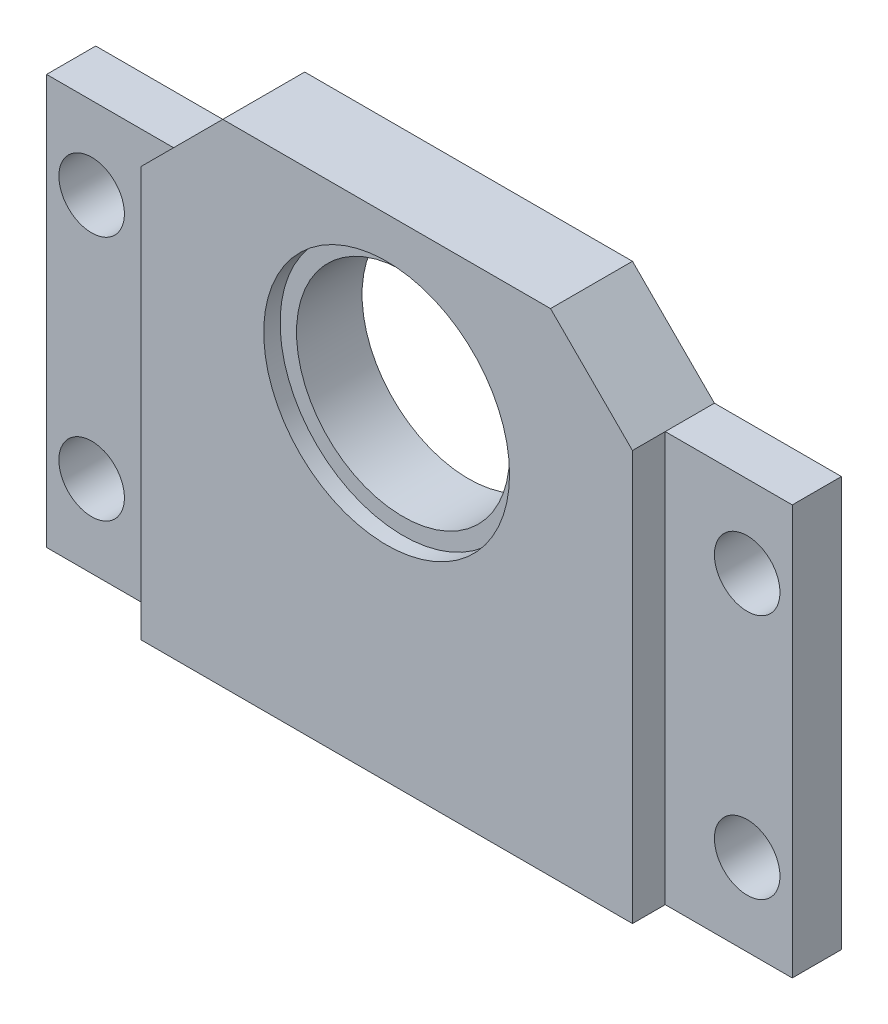
ISO-10303-21;
HEADER;
FILE_DESCRIPTION(('STEP AP214'),'2;1');
FILE_NAME('part.step','',(''),(''),'','','');
FILE_SCHEMA(('AUTOMOTIVE_DESIGN { 1 0 10303 214 1 1 1 1 }'));
ENDSEC;
DATA;
#1=APPLICATION_CONTEXT('core data for automotive mechanical design processes');
#2=APPLICATION_PROTOCOL_DEFINITION('international standard','automotive_design',2000,#1);
#3=PRODUCT_CONTEXT('',#1,'mechanical');
#4=PRODUCT('Part','Part','',(#3));
#5=PRODUCT_RELATED_PRODUCT_CATEGORY('part','',(#4));
#6=PRODUCT_DEFINITION_FORMATION('','',#4);
#7=PRODUCT_DEFINITION_CONTEXT('part definition',#1,'design');
#8=PRODUCT_DEFINITION('design','',#6,#7);
#9=PRODUCT_DEFINITION_SHAPE('','',#8);
#10=(LENGTH_UNIT() NAMED_UNIT(*) SI_UNIT(.MILLI.,.METRE.));
#11=(NAMED_UNIT(*) PLANE_ANGLE_UNIT() SI_UNIT($,.RADIAN.));
#12=(NAMED_UNIT(*) SI_UNIT($,.STERADIAN.) SOLID_ANGLE_UNIT());
#13=UNCERTAINTY_MEASURE_WITH_UNIT(LENGTH_MEASURE(1.E-05),#10,'distance_accuracy_value','');
#14=(GEOMETRIC_REPRESENTATION_CONTEXT(3) GLOBAL_UNCERTAINTY_ASSIGNED_CONTEXT((#13)) GLOBAL_UNIT_ASSIGNED_CONTEXT((#10,
#11,#12)) REPRESENTATION_CONTEXT('',''));
#15=CARTESIAN_POINT('',(0.,0.,0.));
#16=DIRECTION('',(0.,0.,1.));
#17=DIRECTION('',(1.,0.,0.));
#18=AXIS2_PLACEMENT_3D('',#15,#16,#17);
#19=CARTESIAN_POINT('',(22.75,20.,-5.00000000001367E-05));
#20=DIRECTION('',(0.,0.,1.));
#21=DIRECTION('',(1.,0.,0.));
#22=AXIS2_PLACEMENT_3D('',#19,#20,#21);
#23=CYLINDRICAL_SURFACE('',#22,6.5);
#24=CARTESIAN_POINT('',(22.75,20.,0.));
#25=DIRECTION('',(0.,0.,-1.));
#26=DIRECTION('',(-1.,0.,0.));
#27=AXIS2_PLACEMENT_3D('',#24,#25,#26);
#28=CIRCLE('',#27,6.5);
#29=CARTESIAN_POINT('',(29.25,20.,0.));
#30=VERTEX_POINT('',#29);
#31=EDGE_CURVE('E141',#30,#30,#28,.T.);
#32=CARTESIAN_POINT('',(22.75,20.,4.));
#33=DIRECTION('',(0.,0.,1.));
#34=DIRECTION('',(1.,0.,0.));
#35=AXIS2_PLACEMENT_3D('',#32,#33,#34);
#36=CIRCLE('',#35,6.5);
#37=CARTESIAN_POINT('',(29.25,20.,4.));
#38=VERTEX_POINT('',#37);
#39=EDGE_CURVE('E37',#38,#38,#36,.F.);
#40=CARTESIAN_POINT('',(29.25,20.,0.));
#41=CARTESIAN_POINT('',(29.25,20.,0.0416666666666666));
#42=CARTESIAN_POINT('',(29.25,20.,0.0833333333333333));
#43=CARTESIAN_POINT('',(29.25,20.,0.166666666666667));
#44=CARTESIAN_POINT('',(29.25,20.,0.208333333333333));
#45=CARTESIAN_POINT('',(29.25,20.,0.291666666666667));
#46=CARTESIAN_POINT('',(29.25,20.,0.333333333333333));
#47=CARTESIAN_POINT('',(29.25,20.,0.416666666666666));
#48=CARTESIAN_POINT('',(29.25,20.,0.458333333333333));
#49=CARTESIAN_POINT('',(29.25,20.,0.541666666666666));
#50=CARTESIAN_POINT('',(29.25,20.,0.583333333333333));
#51=CARTESIAN_POINT('',(29.25,20.,0.666666666666666));
#52=CARTESIAN_POINT('',(29.25,20.,0.708333333333333));
#53=CARTESIAN_POINT('',(29.25,20.,0.791666666666666));
#54=CARTESIAN_POINT('',(29.25,20.,0.833333333333333));
#55=CARTESIAN_POINT('',(29.25,20.,0.916666666666666));
#56=CARTESIAN_POINT('',(29.25,20.,0.958333333333333));
#57=CARTESIAN_POINT('',(29.25,20.,1.04166666666667));
#58=CARTESIAN_POINT('',(29.25,20.,1.08333333333333));
#59=CARTESIAN_POINT('',(29.25,20.,1.16666666666667));
#60=CARTESIAN_POINT('',(29.25,20.,1.20833333333333));
#61=CARTESIAN_POINT('',(29.25,20.,1.29166666666667));
#62=CARTESIAN_POINT('',(29.25,20.,1.33333333333333));
#63=CARTESIAN_POINT('',(29.25,20.,1.41666666666667));
#64=CARTESIAN_POINT('',(29.25,20.,1.45833333333333));
#65=CARTESIAN_POINT('',(29.25,20.,1.54166666666667));
#66=CARTESIAN_POINT('',(29.25,20.,1.58333333333333));
#67=CARTESIAN_POINT('',(29.25,20.,1.66666666666667));
#68=CARTESIAN_POINT('',(29.25,20.,1.70833333333333));
#69=CARTESIAN_POINT('',(29.25,20.,1.79166666666667));
#70=CARTESIAN_POINT('',(29.25,20.,1.83333333333333));
#71=CARTESIAN_POINT('',(29.25,20.,1.91666666666667));
#72=CARTESIAN_POINT('',(29.25,20.,1.95833333333333));
#73=CARTESIAN_POINT('',(29.25,20.,2.04166666666667));
#74=CARTESIAN_POINT('',(29.25,20.,2.08333333333333));
#75=CARTESIAN_POINT('',(29.25,20.,2.16666666666667));
#76=CARTESIAN_POINT('',(29.25,20.,2.20833333333333));
#77=CARTESIAN_POINT('',(29.25,20.,2.29166666666667));
#78=CARTESIAN_POINT('',(29.25,20.,2.33333333333333));
#79=CARTESIAN_POINT('',(29.25,20.,2.41666666666667));
#80=CARTESIAN_POINT('',(29.25,20.,2.45833333333333));
#81=CARTESIAN_POINT('',(29.25,20.,2.54166666666667));
#82=CARTESIAN_POINT('',(29.25,20.,2.58333333333333));
#83=CARTESIAN_POINT('',(29.25,20.,2.66666666666667));
#84=CARTESIAN_POINT('',(29.25,20.,2.70833333333333));
#85=CARTESIAN_POINT('',(29.25,20.,2.79166666666667));
#86=CARTESIAN_POINT('',(29.25,20.,2.83333333333333));
#87=CARTESIAN_POINT('',(29.25,20.,2.91666666666667));
#88=CARTESIAN_POINT('',(29.25,20.,2.95833333333333));
#89=CARTESIAN_POINT('',(29.25,20.,3.04166666666667));
#90=CARTESIAN_POINT('',(29.25,20.,3.08333333333333));
#91=CARTESIAN_POINT('',(29.25,20.,3.16666666666667));
#92=CARTESIAN_POINT('',(29.25,20.,3.20833333333333));
#93=CARTESIAN_POINT('',(29.25,20.,3.29166666666667));
#94=CARTESIAN_POINT('',(29.25,20.,3.33333333333333));
#95=CARTESIAN_POINT('',(29.25,20.,3.41666666666667));
#96=CARTESIAN_POINT('',(29.25,20.,3.45833333333333));
#97=CARTESIAN_POINT('',(29.25,20.,3.54166666666667));
#98=CARTESIAN_POINT('',(29.25,20.,3.58333333333333));
#99=CARTESIAN_POINT('',(29.25,20.,3.66666666666667));
#100=CARTESIAN_POINT('',(29.25,20.,3.70833333333333));
#101=CARTESIAN_POINT('',(29.25,20.,3.79166666666667));
#102=CARTESIAN_POINT('',(29.25,20.,3.83333333333333));
#103=CARTESIAN_POINT('',(29.25,20.,3.91666666666667));
#104=CARTESIAN_POINT('',(29.25,20.,3.95833333333333));
#105=CARTESIAN_POINT('',(29.25,20.,4.));
#106=B_SPLINE_CURVE_WITH_KNOTS('',3,(#40,#41,#42,#43,#44,#45,#46,#47,#48,#49,#50,#51,#52,#53,
#54,#55,#56,#57,#58,#59,#60,#61,#62,#63,#64,#65,#66,#67,#68,#69,#70,#71,#72,#73,#74,#75,#76,#77,
#78,#79,#80,#81,#82,#83,#84,#85,#86,#87,#88,#89,#90,#91,#92,#93,#94,#95,#96,#97,#98,#99,#100,
#101,#102,#103,#104,#105),.UNSPECIFIED.,.F.,.F.,(4,2,2,2,2,2,2,2,2,2,2,2,2,2,2,2,2,2,2,2,2,2,2,
2,2,2,2,2,2,2,2,2,4),(0.,0.125,0.25,0.375,0.5,0.625,0.75,0.875,1.,1.125,1.25,1.375,1.5,1.625,
1.75,1.875,2.,2.125,2.25,2.375,2.5,2.625,2.75,2.875,3.,3.125,3.25,3.375,3.5,3.625,3.75,3.875,
4.),.UNSPECIFIED.);
#107=EDGE_CURVE('BSEAM33',#30,#38,#106,.T.);
#108=ORIENTED_EDGE('',*,*,#31,.T.);
#109=ORIENTED_EDGE('',*,*,#39,.F.);
#110=ORIENTED_EDGE('',*,*,#107,.T.);
#111=ORIENTED_EDGE('',*,*,#107,.F.);
#112=EDGE_LOOP('',(#108,#110,#109,#111));
#113=FACE_BOUND('',#112,.T.);
#114=ADVANCED_FACE('F33',(#113),#23,.F.);
#115=CARTESIAN_POINT('',(0.,0.,3.));
#116=DIRECTION('',(0.,0.,-1.));
#117=DIRECTION('',(-1.,0.,0.));
#118=AXIS2_PLACEMENT_3D('',#115,#116,#117);
#119=PLANE('',#118);
#120=CARTESIAN_POINT('',(42.75,20.,3.));
#121=DIRECTION('',(0.,0.,1.));
#122=DIRECTION('',(-1.,0.,0.));
#123=AXIS2_PLACEMENT_3D('',#120,#121,#122);
#124=CIRCLE('',#123,2.);
#125=CARTESIAN_POINT('',(40.75,20.,3.));
#126=VERTEX_POINT('',#125);
#127=EDGE_CURVE('E166',#126,#126,#124,.T.);
#128=ORIENTED_EDGE('',*,*,#127,.F.);
#129=EDGE_LOOP('',(#128));
#130=FACE_BOUND('',#129,.T.);
#131=CARTESIAN_POINT('',(42.75,5.,3.));
#132=DIRECTION('',(0.,0.,1.));
#133=DIRECTION('',(1.,0.,0.));
#134=AXIS2_PLACEMENT_3D('',#131,#132,#133);
#135=CIRCLE('',#134,2.);
#136=CARTESIAN_POINT('',(44.75,5.,3.));
#137=VERTEX_POINT('',#136);
#138=EDGE_CURVE('E160',#137,#137,#135,.T.);
#139=ORIENTED_EDGE('',*,*,#138,.F.);
#140=EDGE_LOOP('',(#139));
#141=FACE_BOUND('',#140,.T.);
#142=DIRECTION('',(0.,1.,0.));
#143=VECTOR('',#142,1.);
#144=CARTESIAN_POINT('',(37.75,25.,3.));
#145=LINE('',#144,#143);
#146=CARTESIAN_POINT('',(37.75,0.,3.));
#147=VERTEX_POINT('',#146);
#148=CARTESIAN_POINT('',(37.75,25.,3.));
#149=VERTEX_POINT('',#148);
#150=EDGE_CURVE('E49',#147,#149,#145,.T.);
#151=ORIENTED_EDGE('',*,*,#150,.F.);
#152=DIRECTION('',(1.,0.,0.));
#153=VECTOR('',#152,1.);
#154=CARTESIAN_POINT('',(0.,0.,3.));
#155=LINE('',#154,#153);
#156=CARTESIAN_POINT('',(45.5,0.,3.));
#157=VERTEX_POINT('',#156);
#158=EDGE_CURVE('E184',#147,#157,#155,.T.);
#159=ORIENTED_EDGE('',*,*,#158,.T.);
#160=DIRECTION('',(0.,1.,0.));
#161=VECTOR('',#160,1.);
#162=CARTESIAN_POINT('',(45.5,0.,3.));
#163=LINE('',#162,#161);
#164=CARTESIAN_POINT('',(45.5,25.,3.));
#165=VERTEX_POINT('',#164);
#166=EDGE_CURVE('E188',#157,#165,#163,.T.);
#167=ORIENTED_EDGE('',*,*,#166,.T.);
#168=DIRECTION('',(-1.,0.,0.));
#169=VECTOR('',#168,1.);
#170=CARTESIAN_POINT('',(0.,25.,3.));
#171=LINE('',#170,#169);
#172=EDGE_CURVE('E199',#165,#149,#171,.T.);
#173=ORIENTED_EDGE('',*,*,#172,.T.);
#174=EDGE_LOOP('',(#151,#159,#167,#173));
#175=FACE_BOUND('',#174,.T.);
#176=ADVANCED_FACE('F273',(#130,#141,#175),#119,.F.);
#177=CARTESIAN_POINT('',(2.75,20.,3.));
#178=DIRECTION('',(0.,0.,1.));
#179=DIRECTION('',(1.,0.,0.));
#180=AXIS2_PLACEMENT_3D('',#177,#178,#179);
#181=CIRCLE('',#180,2.);
#182=CARTESIAN_POINT('',(4.75,20.,3.));
#183=VERTEX_POINT('',#182);
#184=EDGE_CURVE('E172',#183,#183,#181,.T.);
#185=ORIENTED_EDGE('',*,*,#184,.F.);
#186=EDGE_LOOP('',(#185));
#187=FACE_BOUND('',#186,.T.);
#188=CARTESIAN_POINT('',(2.75,5.,3.));
#189=DIRECTION('',(0.,0.,1.));
#190=DIRECTION('',(-1.,0.,0.));
#191=AXIS2_PLACEMENT_3D('',#188,#189,#190);
#192=CIRCLE('',#191,2.);
#193=CARTESIAN_POINT('',(0.749999999999998,5.,3.));
#194=VERTEX_POINT('',#193);
#195=EDGE_CURVE('E155',#194,#194,#192,.T.);
#196=ORIENTED_EDGE('',*,*,#195,.F.);
#197=EDGE_LOOP('',(#196));
#198=FACE_BOUND('',#197,.T.);
#199=DIRECTION('',(0.,-1.,0.));
#200=VECTOR('',#199,1.);
#201=CARTESIAN_POINT('',(7.75,25.,3.));
#202=LINE('',#201,#200);
#203=CARTESIAN_POINT('',(7.75000000000002,25.,3.));
#204=VERTEX_POINT('',#203);
#205=CARTESIAN_POINT('',(7.75,0.,3.));
#206=VERTEX_POINT('',#205);
#207=EDGE_CURVE('E57',#204,#206,#202,.T.);
#208=ORIENTED_EDGE('',*,*,#207,.F.);
#209=CARTESIAN_POINT('',(0.,25.,3.));
#210=VERTEX_POINT('',#209);
#211=EDGE_CURVE('E190',#204,#210,#171,.T.);
#212=ORIENTED_EDGE('',*,*,#211,.T.);
#213=DIRECTION('',(0.,-1.,0.));
#214=VECTOR('',#213,1.);
#215=CARTESIAN_POINT('',(0.,0.,3.));
#216=LINE('',#215,#214);
#217=CARTESIAN_POINT('',(0.,0.,3.));
#218=VERTEX_POINT('',#217);
#219=EDGE_CURVE('E181',#210,#218,#216,.T.);
#220=ORIENTED_EDGE('',*,*,#219,.T.);
#221=EDGE_CURVE('E186',#218,#206,#155,.T.);
#222=ORIENTED_EDGE('',*,*,#221,.T.);
#223=EDGE_LOOP('',(#208,#212,#220,#222));
#224=FACE_BOUND('',#223,.T.);
#225=ADVANCED_FACE('F275',(#187,#198,#224),#119,.F.);
#226=CARTESIAN_POINT('',(0.,25.,3.));
#227=DIRECTION('',(0.,-1.,0.));
#228=DIRECTION('',(0.,0.,-1.));
#229=AXIS2_PLACEMENT_3D('',#226,#227,#228);
#230=PLANE('',#229);
#231=ORIENTED_EDGE('',*,*,#211,.F.);
#232=DIRECTION('',(0.,0.,-1.));
#233=VECTOR('',#232,1.);
#234=CARTESIAN_POINT('',(7.75000000000002,25.,3.));
#235=LINE('',#234,#233);
#236=CARTESIAN_POINT('',(7.75000000000002,25.,0.));
#237=VERTEX_POINT('',#236);
#238=EDGE_CURVE('E140',#204,#237,#235,.T.);
#239=ORIENTED_EDGE('',*,*,#238,.T.);
#240=DIRECTION('',(-1.,0.,0.));
#241=VECTOR('',#240,1.);
#242=CARTESIAN_POINT('',(0.,25.,0.));
#243=LINE('',#242,#241);
#244=CARTESIAN_POINT('',(0.,25.,0.));
#245=VERTEX_POINT('',#244);
#246=EDGE_CURVE('E207',#237,#245,#243,.T.);
#247=ORIENTED_EDGE('',*,*,#246,.T.);
#248=DIRECTION('',(0.,0.,-1.));
#249=VECTOR('',#248,1.);
#250=CARTESIAN_POINT('',(0.,25.,3.));
#251=LINE('',#250,#249);
#252=EDGE_CURVE('E201',#210,#245,#251,.T.);
#253=ORIENTED_EDGE('',*,*,#252,.F.);
#254=EDGE_LOOP('',(#231,#239,#247,#253));
#255=FACE_BOUND('',#254,.T.);
#256=ADVANCED_FACE('F251',(#255),#230,.F.);
#257=CARTESIAN_POINT('',(0.,0.,3.));
#258=DIRECTION('',(1.,0.,0.));
#259=DIRECTION('',(0.,0.,-1.));
#260=AXIS2_PLACEMENT_3D('',#257,#258,#259);
#261=PLANE('',#260);
#262=DIRECTION('',(0.,-1.,0.));
#263=VECTOR('',#262,1.);
#264=CARTESIAN_POINT('',(0.,0.,0.));
#265=LINE('',#264,#263);
#266=CARTESIAN_POINT('',(0.,0.,0.));
#267=VERTEX_POINT('',#266);
#268=EDGE_CURVE('E178',#245,#267,#265,.T.);
#269=ORIENTED_EDGE('',*,*,#268,.T.);
#270=DIRECTION('',(0.,0.,-1.));
#271=VECTOR('',#270,1.);
#272=CARTESIAN_POINT('',(0.,0.,3.));
#273=LINE('',#272,#271);
#274=EDGE_CURVE('E206',#218,#267,#273,.T.);
#275=ORIENTED_EDGE('',*,*,#274,.F.);
#276=ORIENTED_EDGE('',*,*,#219,.F.);
#277=ORIENTED_EDGE('',*,*,#252,.T.);
#278=EDGE_LOOP('',(#269,#275,#276,#277));
#279=FACE_BOUND('',#278,.T.);
#280=ADVANCED_FACE('F230',(#279),#261,.F.);
#281=CARTESIAN_POINT('',(0.,0.,3.));
#282=DIRECTION('',(0.,1.,0.));
#283=DIRECTION('',(0.,0.,1.));
#284=AXIS2_PLACEMENT_3D('',#281,#282,#283);
#285=PLANE('',#284);
#286=DIRECTION('',(1.,0.,0.));
#287=VECTOR('',#286,1.);
#288=CARTESIAN_POINT('',(0.,0.,0.));
#289=LINE('',#288,#287);
#290=CARTESIAN_POINT('',(45.5,0.,0.));
#291=VERTEX_POINT('',#290);
#292=EDGE_CURVE('E226',#267,#291,#289,.T.);
#293=ORIENTED_EDGE('',*,*,#292,.T.);
#294=DIRECTION('',(0.,0.,-1.));
#295=VECTOR('',#294,1.);
#296=CARTESIAN_POINT('',(45.5,0.,3.));
#297=LINE('',#296,#295);
#298=EDGE_CURVE('E218',#157,#291,#297,.T.);
#299=ORIENTED_EDGE('',*,*,#298,.F.);
#300=ORIENTED_EDGE('',*,*,#158,.F.);
#301=DIRECTION('',(0.,0.,-1.));
#302=VECTOR('',#301,1.);
#303=CARTESIAN_POINT('',(37.75,0.,5.));
#304=LINE('',#303,#302);
#305=CARTESIAN_POINT('',(37.75,0.,5.));
#306=VERTEX_POINT('',#305);
#307=EDGE_CURVE('E146',#306,#147,#304,.T.);
#308=ORIENTED_EDGE('',*,*,#307,.F.);
#309=DIRECTION('',(1.,0.,0.));
#310=VECTOR('',#309,1.);
#311=CARTESIAN_POINT('',(7.75,0.,5.));
#312=LINE('',#311,#310);
#313=CARTESIAN_POINT('',(7.75,0.,5.));
#314=VERTEX_POINT('',#313);
#315=EDGE_CURVE('E126',#314,#306,#312,.T.);
#316=ORIENTED_EDGE('',*,*,#315,.F.);
#317=DIRECTION('',(0.,0.,-1.));
#318=VECTOR('',#317,1.);
#319=CARTESIAN_POINT('',(7.75,0.,5.));
#320=LINE('',#319,#318);
#321=EDGE_CURVE('E123',#314,#206,#320,.T.);
#322=ORIENTED_EDGE('',*,*,#321,.T.);
#323=ORIENTED_EDGE('',*,*,#221,.F.);
#324=ORIENTED_EDGE('',*,*,#274,.T.);
#325=EDGE_LOOP('',(#293,#299,#300,#308,#316,#322,#323,#324));
#326=FACE_BOUND('',#325,.T.);
#327=ADVANCED_FACE('F224',(#326),#285,.F.);
#328=CARTESIAN_POINT('',(45.5,0.,3.));
#329=DIRECTION('',(-1.,0.,0.));
#330=DIRECTION('',(0.,0.,1.));
#331=AXIS2_PLACEMENT_3D('',#328,#329,#330);
#332=PLANE('',#331);
#333=DIRECTION('',(0.,1.,0.));
#334=VECTOR('',#333,1.);
#335=CARTESIAN_POINT('',(45.5,0.,0.));
#336=LINE('',#335,#334);
#337=CARTESIAN_POINT('',(45.5,25.,0.));
#338=VERTEX_POINT('',#337);
#339=EDGE_CURVE('E208',#291,#338,#336,.T.);
#340=ORIENTED_EDGE('',*,*,#339,.T.);
#341=DIRECTION('',(0.,0.,-1.));
#342=VECTOR('',#341,1.);
#343=CARTESIAN_POINT('',(45.5,25.,3.));
#344=LINE('',#343,#342);
#345=EDGE_CURVE('E215',#165,#338,#344,.T.);
#346=ORIENTED_EDGE('',*,*,#345,.F.);
#347=ORIENTED_EDGE('',*,*,#166,.F.);
#348=ORIENTED_EDGE('',*,*,#298,.T.);
#349=EDGE_LOOP('',(#340,#346,#347,#348));
#350=FACE_BOUND('',#349,.T.);
#351=ADVANCED_FACE('F237',(#350),#332,.F.);
#352=CARTESIAN_POINT('',(37.75,25.,0.));
#353=VERTEX_POINT('',#352);
#354=EDGE_CURVE('E185',#338,#353,#243,.T.);
#355=ORIENTED_EDGE('',*,*,#354,.T.);
#356=DIRECTION('',(0.,0.,1.));
#357=VECTOR('',#356,1.);
#358=CARTESIAN_POINT('',(37.75,25.,3.));
#359=LINE('',#358,#357);
#360=EDGE_CURVE('E205',#353,#149,#359,.T.);
#361=ORIENTED_EDGE('',*,*,#360,.T.);
#362=ORIENTED_EDGE('',*,*,#172,.F.);
#363=ORIENTED_EDGE('',*,*,#345,.T.);
#364=EDGE_LOOP('',(#355,#361,#362,#363));
#365=FACE_BOUND('',#364,.T.);
#366=ADVANCED_FACE('F243',(#365),#230,.F.);
#367=CARTESIAN_POINT('',(0.,0.,0.));
#368=DIRECTION('',(0.,0.,-1.));
#369=DIRECTION('',(-1.,0.,0.));
#370=AXIS2_PLACEMENT_3D('',#367,#368,#369);
#371=PLANE('',#370);
#372=ORIENTED_EDGE('',*,*,#31,.F.);
#373=EDGE_LOOP('',(#372));
#374=FACE_BOUND('',#373,.T.);
#375=CARTESIAN_POINT('',(2.75,5.,0.));
#376=DIRECTION('',(0.,0.,1.));
#377=DIRECTION('',(-1.,0.,0.));
#378=AXIS2_PLACEMENT_3D('',#375,#376,#377);
#379=CIRCLE('',#378,2.);
#380=CARTESIAN_POINT('',(0.749999999999998,5.,0.));
#381=VERTEX_POINT('',#380);
#382=EDGE_CURVE('E157',#381,#381,#379,.T.);
#383=ORIENTED_EDGE('',*,*,#382,.T.);
#384=EDGE_LOOP('',(#383));
#385=FACE_BOUND('',#384,.T.);
#386=CARTESIAN_POINT('',(42.75,5.,0.));
#387=DIRECTION('',(0.,0.,1.));
#388=DIRECTION('',(1.,0.,0.));
#389=AXIS2_PLACEMENT_3D('',#386,#387,#388);
#390=CIRCLE('',#389,2.);
#391=CARTESIAN_POINT('',(44.75,5.,0.));
#392=VERTEX_POINT('',#391);
#393=EDGE_CURVE('E163',#392,#392,#390,.T.);
#394=ORIENTED_EDGE('',*,*,#393,.T.);
#395=EDGE_LOOP('',(#394));
#396=FACE_BOUND('',#395,.T.);
#397=CARTESIAN_POINT('',(42.75,20.,0.));
#398=DIRECTION('',(0.,0.,1.));
#399=DIRECTION('',(-1.,0.,0.));
#400=AXIS2_PLACEMENT_3D('',#397,#398,#399);
#401=CIRCLE('',#400,2.);
#402=CARTESIAN_POINT('',(40.75,20.,0.));
#403=VERTEX_POINT('',#402);
#404=EDGE_CURVE('E169',#403,#403,#401,.T.);
#405=ORIENTED_EDGE('',*,*,#404,.T.);
#406=EDGE_LOOP('',(#405));
#407=FACE_BOUND('',#406,.T.);
#408=CARTESIAN_POINT('',(2.75,20.,0.));
#409=DIRECTION('',(0.,0.,1.));
#410=DIRECTION('',(1.,0.,0.));
#411=AXIS2_PLACEMENT_3D('',#408,#409,#410);
#412=CIRCLE('',#411,2.);
#413=CARTESIAN_POINT('',(4.75,20.,0.));
#414=VERTEX_POINT('',#413);
#415=EDGE_CURVE('E175',#414,#414,#412,.T.);
#416=ORIENTED_EDGE('',*,*,#415,.T.);
#417=EDGE_LOOP('',(#416));
#418=FACE_BOUND('',#417,.T.);
#419=ORIENTED_EDGE('',*,*,#268,.F.);
#420=ORIENTED_EDGE('',*,*,#246,.F.);
#421=DIRECTION('',(0.707106781186544,0.707106781186551,0.));
#422=VECTOR('',#421,1.);
#423=CARTESIAN_POINT('',(12.75,30.,0.));
#424=LINE('',#423,#422);
#425=CARTESIAN_POINT('',(12.75,30.,0.));
#426=VERTEX_POINT('',#425);
#427=EDGE_CURVE('E11',#237,#426,#424,.T.);
#428=ORIENTED_EDGE('',*,*,#427,.T.);
#429=DIRECTION('',(-1.,0.,0.));
#430=VECTOR('',#429,1.);
#431=CARTESIAN_POINT('',(12.75,30.,0.));
#432=LINE('',#431,#430);
#433=CARTESIAN_POINT('',(32.75,30.,0.));
#434=VERTEX_POINT('',#433);
#435=EDGE_CURVE('E144',#434,#426,#432,.T.);
#436=ORIENTED_EDGE('',*,*,#435,.F.);
#437=DIRECTION('',(0.707106781186552,-0.707106781186543,0.));
#438=VECTOR('',#437,1.);
#439=CARTESIAN_POINT('',(37.75,25.,0.));
#440=LINE('',#439,#438);
#441=EDGE_CURVE('E42',#434,#353,#440,.T.);
#442=ORIENTED_EDGE('',*,*,#441,.T.);
#443=ORIENTED_EDGE('',*,*,#354,.F.);
#444=ORIENTED_EDGE('',*,*,#339,.F.);
#445=ORIENTED_EDGE('',*,*,#292,.F.);
#446=EDGE_LOOP('',(#419,#420,#428,#436,#442,#443,#444,#445));
#447=FACE_BOUND('',#446,.T.);
#448=ADVANCED_FACE('F245',(#374,#385,#396,#407,#418,#447),#371,.T.);
#449=CARTESIAN_POINT('',(2.75,20.,0.));
#450=DIRECTION('',(0.,0.,1.));
#451=DIRECTION('',(1.,0.,0.));
#452=AXIS2_PLACEMENT_3D('',#449,#450,#451);
#453=CYLINDRICAL_SURFACE('',#452,2.);
#454=ORIENTED_EDGE('',*,*,#415,.F.);
#455=EDGE_LOOP('',(#454));
#456=FACE_BOUND('',#455,.T.);
#457=ORIENTED_EDGE('',*,*,#184,.T.);
#458=EDGE_LOOP('',(#457));
#459=FACE_BOUND('',#458,.T.);
#460=ADVANCED_FACE('F289',(#456,#459),#453,.F.);
#461=CARTESIAN_POINT('',(42.75,20.,0.));
#462=DIRECTION('',(0.,0.,1.));
#463=DIRECTION('',(1.,0.,0.));
#464=AXIS2_PLACEMENT_3D('',#461,#462,#463);
#465=CYLINDRICAL_SURFACE('',#464,2.);
#466=ORIENTED_EDGE('',*,*,#404,.F.);
#467=EDGE_LOOP('',(#466));
#468=FACE_BOUND('',#467,.T.);
#469=ORIENTED_EDGE('',*,*,#127,.T.);
#470=EDGE_LOOP('',(#469));
#471=FACE_BOUND('',#470,.T.);
#472=ADVANCED_FACE('F317',(#468,#471),#465,.F.);
#473=CARTESIAN_POINT('',(42.75,5.,0.));
#474=DIRECTION('',(0.,0.,1.));
#475=DIRECTION('',(1.,0.,0.));
#476=AXIS2_PLACEMENT_3D('',#473,#474,#475);
#477=CYLINDRICAL_SURFACE('',#476,2.);
#478=ORIENTED_EDGE('',*,*,#393,.F.);
#479=EDGE_LOOP('',(#478));
#480=FACE_BOUND('',#479,.T.);
#481=ORIENTED_EDGE('',*,*,#138,.T.);
#482=EDGE_LOOP('',(#481));
#483=FACE_BOUND('',#482,.T.);
#484=ADVANCED_FACE('F311',(#480,#483),#477,.F.);
#485=CARTESIAN_POINT('',(2.75,5.,0.));
#486=DIRECTION('',(0.,0.,1.));
#487=DIRECTION('',(1.,0.,0.));
#488=AXIS2_PLACEMENT_3D('',#485,#486,#487);
#489=CYLINDRICAL_SURFACE('',#488,2.);
#490=ORIENTED_EDGE('',*,*,#382,.F.);
#491=EDGE_LOOP('',(#490));
#492=FACE_BOUND('',#491,.T.);
#493=ORIENTED_EDGE('',*,*,#195,.T.);
#494=EDGE_LOOP('',(#493));
#495=FACE_BOUND('',#494,.T.);
#496=ADVANCED_FACE('F306',(#492,#495),#489,.F.);
#497=CARTESIAN_POINT('',(12.75,30.,0.));
#498=DIRECTION('',(0.,1.,0.));
#499=DIRECTION('',(-1.,0.,0.));
#500=AXIS2_PLACEMENT_3D('',#497,#498,#499);
#501=PLANE('',#500);
#502=DIRECTION('',(0.,0.,1.));
#503=VECTOR('',#502,1.);
#504=CARTESIAN_POINT('',(12.75,30.,0.));
#505=LINE('',#504,#503);
#506=CARTESIAN_POINT('',(12.75,30.,5.));
#507=VERTEX_POINT('',#506);
#508=EDGE_CURVE('E153',#426,#507,#505,.T.);
#509=ORIENTED_EDGE('',*,*,#508,.T.);
#510=DIRECTION('',(-1.,0.,0.));
#511=VECTOR('',#510,1.);
#512=CARTESIAN_POINT('',(32.75,30.,5.));
#513=LINE('',#512,#511);
#514=CARTESIAN_POINT('',(32.75,30.,5.));
#515=VERTEX_POINT('',#514);
#516=EDGE_CURVE('E134',#515,#507,#513,.T.);
#517=ORIENTED_EDGE('',*,*,#516,.F.);
#518=DIRECTION('',(0.,0.,1.));
#519=VECTOR('',#518,1.);
#520=CARTESIAN_POINT('',(32.75,30.,0.));
#521=LINE('',#520,#519);
#522=EDGE_CURVE('E152',#434,#515,#521,.T.);
#523=ORIENTED_EDGE('',*,*,#522,.F.);
#524=ORIENTED_EDGE('',*,*,#435,.T.);
#525=EDGE_LOOP('',(#509,#517,#523,#524));
#526=FACE_BOUND('',#525,.T.);
#527=ADVANCED_FACE('F253',(#526),#501,.T.);
#528=CARTESIAN_POINT('',(37.75,25.,3.));
#529=DIRECTION('',(-0.707106781186543,-0.707106781186552,0.));
#530=DIRECTION('',(0.,0.,1.));
#531=AXIS2_PLACEMENT_3D('',#528,#529,#530);
#532=PLANE('',#531);
#533=ORIENTED_EDGE('',*,*,#441,.F.);
#534=ORIENTED_EDGE('',*,*,#522,.T.);
#535=DIRECTION('',(-0.70710678118655,0.707106781186545,0.));
#536=VECTOR('',#535,1.);
#537=CARTESIAN_POINT('',(32.75,30.,5.));
#538=LINE('',#537,#536);
#539=CARTESIAN_POINT('',(37.75,25.,5.));
#540=VERTEX_POINT('',#539);
#541=EDGE_CURVE('E257',#540,#515,#538,.T.);
#542=ORIENTED_EDGE('',*,*,#541,.F.);
#543=DIRECTION('',(0.,0.,-1.));
#544=VECTOR('',#543,1.);
#545=CARTESIAN_POINT('',(37.75,25.,5.));
#546=LINE('',#545,#544);
#547=EDGE_CURVE('E262',#540,#149,#546,.T.);
#548=ORIENTED_EDGE('',*,*,#547,.T.);
#549=ORIENTED_EDGE('',*,*,#360,.F.);
#550=EDGE_LOOP('',(#533,#534,#542,#548,#549));
#551=FACE_BOUND('',#550,.T.);
#552=ADVANCED_FACE('F255',(#551),#532,.F.);
#553=CARTESIAN_POINT('',(12.75,30.,0.));
#554=DIRECTION('',(0.707106781186552,-0.707106781186544,0.));
#555=DIRECTION('',(0.,0.,1.));
#556=AXIS2_PLACEMENT_3D('',#553,#554,#555);
#557=PLANE('',#556);
#558=ORIENTED_EDGE('',*,*,#427,.F.);
#559=ORIENTED_EDGE('',*,*,#238,.F.);
#560=DIRECTION('',(0.,0.,-1.));
#561=VECTOR('',#560,1.);
#562=CARTESIAN_POINT('',(7.75,25.,5.));
#563=LINE('',#562,#561);
#564=CARTESIAN_POINT('',(7.75,25.,5.));
#565=VERTEX_POINT('',#564);
#566=EDGE_CURVE('E121',#565,#204,#563,.T.);
#567=ORIENTED_EDGE('',*,*,#566,.F.);
#568=DIRECTION('',(-0.707106781186549,-0.707106781186546,0.));
#569=VECTOR('',#568,1.);
#570=CARTESIAN_POINT('',(12.75,30.,5.));
#571=LINE('',#570,#569);
#572=EDGE_CURVE('E127',#507,#565,#571,.T.);
#573=ORIENTED_EDGE('',*,*,#572,.F.);
#574=ORIENTED_EDGE('',*,*,#508,.F.);
#575=EDGE_LOOP('',(#558,#559,#567,#573,#574));
#576=FACE_BOUND('',#575,.T.);
#577=ADVANCED_FACE('F35',(#576),#557,.F.);
#578=CARTESIAN_POINT('',(0.,0.,5.));
#579=DIRECTION('',(0.,0.,1.));
#580=DIRECTION('',(1.,0.,0.));
#581=AXIS2_PLACEMENT_3D('',#578,#579,#580);
#582=PLANE('',#581);
#583=CARTESIAN_POINT('',(22.75,20.,5.));
#584=DIRECTION('',(0.,0.,1.));
#585=DIRECTION('',(1.,0.,0.));
#586=AXIS2_PLACEMENT_3D('',#583,#584,#585);
#587=CIRCLE('',#586,7.5);
#588=CARTESIAN_POINT('',(30.25,20.,5.));
#589=VERTEX_POINT('',#588);
#590=EDGE_CURVE('E465',#589,#589,#587,.T.);
#591=ORIENTED_EDGE('',*,*,#590,.F.);
#592=EDGE_LOOP('',(#591));
#593=FACE_BOUND('',#592,.T.);
#594=ORIENTED_EDGE('',*,*,#572,.T.);
#595=DIRECTION('',(0.,-1.,0.));
#596=VECTOR('',#595,1.);
#597=CARTESIAN_POINT('',(7.75,25.,5.));
#598=LINE('',#597,#596);
#599=EDGE_CURVE('E117',#565,#314,#598,.T.);
#600=ORIENTED_EDGE('',*,*,#599,.T.);
#601=ORIENTED_EDGE('',*,*,#315,.T.);
#602=DIRECTION('',(0.,1.,0.));
#603=VECTOR('',#602,1.);
#604=CARTESIAN_POINT('',(37.75,25.,5.));
#605=LINE('',#604,#603);
#606=EDGE_CURVE('E259',#306,#540,#605,.T.);
#607=ORIENTED_EDGE('',*,*,#606,.T.);
#608=ORIENTED_EDGE('',*,*,#541,.T.);
#609=ORIENTED_EDGE('',*,*,#516,.T.);
#610=EDGE_LOOP('',(#594,#600,#601,#607,#608,#609));
#611=FACE_BOUND('',#610,.T.);
#612=ADVANCED_FACE('F131',(#593,#611),#582,.T.);
#613=CARTESIAN_POINT('',(7.75,25.,5.));
#614=DIRECTION('',(1.,0.,0.));
#615=DIRECTION('',(0.,1.,0.));
#616=AXIS2_PLACEMENT_3D('',#613,#614,#615);
#617=PLANE('',#616);
#618=ORIENTED_EDGE('',*,*,#207,.T.);
#619=ORIENTED_EDGE('',*,*,#321,.F.);
#620=ORIENTED_EDGE('',*,*,#599,.F.);
#621=ORIENTED_EDGE('',*,*,#566,.T.);
#622=EDGE_LOOP('',(#618,#619,#620,#621));
#623=FACE_BOUND('',#622,.T.);
#624=ADVANCED_FACE('F119',(#623),#617,.F.);
#625=CARTESIAN_POINT('',(37.75,25.,5.));
#626=DIRECTION('',(-1.,0.,0.));
#627=DIRECTION('',(0.,0.,1.));
#628=AXIS2_PLACEMENT_3D('',#625,#626,#627);
#629=PLANE('',#628);
#630=ORIENTED_EDGE('',*,*,#150,.T.);
#631=ORIENTED_EDGE('',*,*,#547,.F.);
#632=ORIENTED_EDGE('',*,*,#606,.F.);
#633=ORIENTED_EDGE('',*,*,#307,.T.);
#634=EDGE_LOOP('',(#630,#631,#632,#633));
#635=FACE_BOUND('',#634,.T.);
#636=ADVANCED_FACE('F272',(#635),#629,.F.);
#637=CARTESIAN_POINT('',(22.75,20.,4.));
#638=DIRECTION('',(0.,0.,1.));
#639=DIRECTION('',(1.,0.,0.));
#640=AXIS2_PLACEMENT_3D('',#637,#638,#639);
#641=PLANE('',#640);
#642=CARTESIAN_POINT('',(22.75,20.,4.));
#643=DIRECTION('',(0.,0.,1.));
#644=DIRECTION('',(1.,0.,0.));
#645=AXIS2_PLACEMENT_3D('',#642,#643,#644);
#646=CIRCLE('',#645,7.5);
#647=CARTESIAN_POINT('',(30.25,20.,4.));
#648=VERTEX_POINT('',#647);
#649=EDGE_CURVE('E462',#648,#648,#646,.T.);
#650=ORIENTED_EDGE('',*,*,#649,.T.);
#651=EDGE_LOOP('',(#650));
#652=FACE_BOUND('',#651,.T.);
#653=ORIENTED_EDGE('',*,*,#39,.T.);
#654=EDGE_LOOP('',(#653));
#655=FACE_BOUND('',#654,.T.);
#656=ADVANCED_FACE('F428',(#652,#655),#641,.T.);
#657=CARTESIAN_POINT('',(22.75,20.,4.));
#658=DIRECTION('',(0.,0.,1.));
#659=DIRECTION('',(1.,0.,0.));
#660=AXIS2_PLACEMENT_3D('',#657,#658,#659);
#661=CYLINDRICAL_SURFACE('',#660,7.5);
#662=ORIENTED_EDGE('',*,*,#649,.F.);
#663=EDGE_LOOP('',(#662));
#664=FACE_BOUND('',#663,.T.);
#665=ORIENTED_EDGE('',*,*,#590,.T.);
#666=EDGE_LOOP('',(#665));
#667=FACE_BOUND('',#666,.T.);
#668=ADVANCED_FACE('F442',(#664,#667),#661,.F.);
#669=CLOSED_SHELL('',(#114,#176,#225,#256,#280,#327,#351,#366,#448,#460,#472,#484,#496,#527,
#552,#577,#612,#624,#636,#656,#668));
#670=MANIFOLD_SOLID_BREP('B2',#669);
#671=ADVANCED_BREP_SHAPE_REPRESENTATION('',(#18,#670),#14);
#672=SHAPE_DEFINITION_REPRESENTATION(#9,#671);
ENDSEC;
END-ISO-10303-21;
